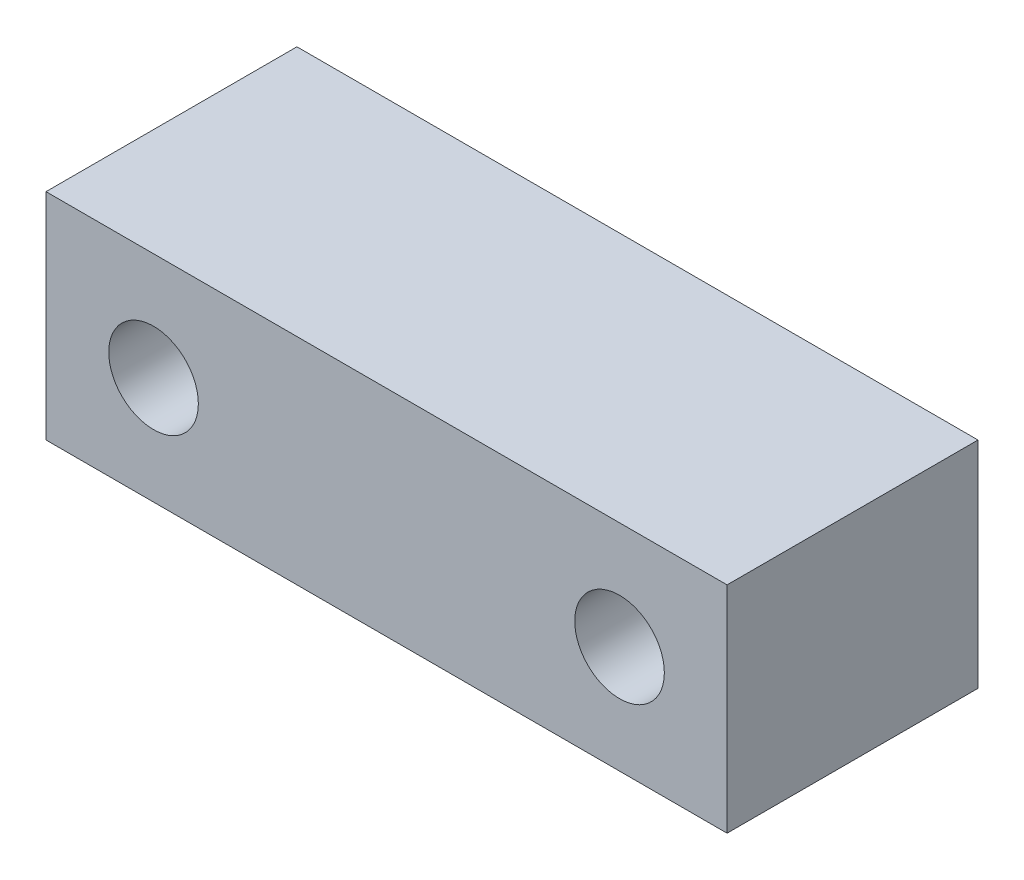
ISO-10303-21;
HEADER;
FILE_DESCRIPTION(('STEP AP214'),'2;1');
FILE_NAME('part.step','',(''),(''),'','','');
FILE_SCHEMA(('AUTOMOTIVE_DESIGN { 1 0 10303 214 1 1 1 1 }'));
ENDSEC;
DATA;
#1=APPLICATION_CONTEXT('core data for automotive mechanical design processes');
#2=APPLICATION_PROTOCOL_DEFINITION('international standard','automotive_design',2000,#1);
#3=PRODUCT_CONTEXT('',#1,'mechanical');
#4=PRODUCT('Part','Part','',(#3));
#5=PRODUCT_RELATED_PRODUCT_CATEGORY('part','',(#4));
#6=PRODUCT_DEFINITION_FORMATION('','',#4);
#7=PRODUCT_DEFINITION_CONTEXT('part definition',#1,'design');
#8=PRODUCT_DEFINITION('design','',#6,#7);
#9=PRODUCT_DEFINITION_SHAPE('','',#8);
#10=(LENGTH_UNIT() NAMED_UNIT(*) SI_UNIT(.MILLI.,.METRE.));
#11=(NAMED_UNIT(*) PLANE_ANGLE_UNIT() SI_UNIT($,.RADIAN.));
#12=(NAMED_UNIT(*) SI_UNIT($,.STERADIAN.) SOLID_ANGLE_UNIT());
#13=UNCERTAINTY_MEASURE_WITH_UNIT(LENGTH_MEASURE(1.E-05),#10,'distance_accuracy_value','');
#14=(GEOMETRIC_REPRESENTATION_CONTEXT(3) GLOBAL_UNCERTAINTY_ASSIGNED_CONTEXT((#13)) GLOBAL_UNIT_ASSIGNED_CONTEXT((#10,
#11,#12)) REPRESENTATION_CONTEXT('',''));
#15=CARTESIAN_POINT('',(0.,0.,0.));
#16=DIRECTION('',(0.,0.,1.));
#17=DIRECTION('',(1.,0.,0.));
#18=AXIS2_PLACEMENT_3D('',#15,#16,#17);
#19=CARTESIAN_POINT('',(0.,0.,7.));
#20=DIRECTION('',(0.,0.,1.));
#21=DIRECTION('',(1.,0.,0.));
#22=AXIS2_PLACEMENT_3D('',#19,#20,#21);
#23=PLANE('',#22);
#24=CARTESIAN_POINT('',(-6.5,0.,7.));
#25=DIRECTION('',(0.,0.,1.));
#26=DIRECTION('',(1.,0.,0.));
#27=AXIS2_PLACEMENT_3D('',#24,#25,#26);
#28=CIRCLE('',#27,1.25);
#29=CARTESIAN_POINT('',(-5.25,0.,7.));
#30=VERTEX_POINT('',#29);
#31=EDGE_CURVE('E106',#30,#30,#28,.T.);
#32=ORIENTED_EDGE('',*,*,#31,.F.);
#33=EDGE_LOOP('',(#32));
#34=FACE_BOUND('',#33,.T.);
#35=DIRECTION('',(-1.,0.,0.));
#36=VECTOR('',#35,1.);
#37=CARTESIAN_POINT('',(-9.5,3.,7.));
#38=LINE('',#37,#36);
#39=CARTESIAN_POINT('',(9.5,3.,7.));
#40=VERTEX_POINT('',#39);
#41=CARTESIAN_POINT('',(-9.5,3.,7.));
#42=VERTEX_POINT('',#41);
#43=EDGE_CURVE('E91',#40,#42,#38,.T.);
#44=ORIENTED_EDGE('',*,*,#43,.T.);
#45=DIRECTION('',(0.,-1.,0.));
#46=VECTOR('',#45,1.);
#47=CARTESIAN_POINT('',(-9.5,-3.,7.));
#48=LINE('',#47,#46);
#49=CARTESIAN_POINT('',(-9.5,-3.,7.));
#50=VERTEX_POINT('',#49);
#51=EDGE_CURVE('E87',#42,#50,#48,.T.);
#52=ORIENTED_EDGE('',*,*,#51,.T.);
#53=DIRECTION('',(1.,0.,0.));
#54=VECTOR('',#53,1.);
#55=CARTESIAN_POINT('',(-9.5,-3.,7.));
#56=LINE('',#55,#54);
#57=CARTESIAN_POINT('',(9.5,-3.,7.));
#58=VERTEX_POINT('',#57);
#59=EDGE_CURVE('E86',#50,#58,#56,.T.);
#60=ORIENTED_EDGE('',*,*,#59,.T.);
#61=DIRECTION('',(0.,1.,0.));
#62=VECTOR('',#61,1.);
#63=CARTESIAN_POINT('',(9.5,-3.,7.));
#64=LINE('',#63,#62);
#65=EDGE_CURVE('E57',#58,#40,#64,.T.);
#66=ORIENTED_EDGE('',*,*,#65,.T.);
#67=EDGE_LOOP('',(#44,#52,#60,#66));
#68=FACE_BOUND('',#67,.T.);
#69=CARTESIAN_POINT('',(6.5,0.,7.));
#70=DIRECTION('',(0.,0.,1.));
#71=DIRECTION('',(1.,0.,0.));
#72=AXIS2_PLACEMENT_3D('',#69,#70,#71);
#73=CIRCLE('',#72,1.25);
#74=CARTESIAN_POINT('',(7.75,0.,7.));
#75=VERTEX_POINT('',#74);
#76=EDGE_CURVE('E122',#75,#75,#73,.T.);
#77=ORIENTED_EDGE('',*,*,#76,.F.);
#78=EDGE_LOOP('',(#77));
#79=FACE_BOUND('',#78,.T.);
#80=ADVANCED_FACE('F39',(#34,#68,#79),#23,.T.);
#81=CARTESIAN_POINT('',(0.,0.,0.));
#82=DIRECTION('',(0.,0.,1.));
#83=DIRECTION('',(1.,0.,0.));
#84=AXIS2_PLACEMENT_3D('',#81,#82,#83);
#85=PLANE('',#84);
#86=DIRECTION('',(-1.,0.,0.));
#87=VECTOR('',#86,1.);
#88=CARTESIAN_POINT('',(-9.5,3.,0.));
#89=LINE('',#88,#87);
#90=CARTESIAN_POINT('',(9.5,3.,0.));
#91=VERTEX_POINT('',#90);
#92=CARTESIAN_POINT('',(-9.5,3.,0.));
#93=VERTEX_POINT('',#92);
#94=EDGE_CURVE('E101',#91,#93,#89,.T.);
#95=ORIENTED_EDGE('',*,*,#94,.F.);
#96=DIRECTION('',(0.,1.,0.));
#97=VECTOR('',#96,1.);
#98=CARTESIAN_POINT('',(9.5,-3.,0.));
#99=LINE('',#98,#97);
#100=CARTESIAN_POINT('',(9.5,-3.,0.));
#101=VERTEX_POINT('',#100);
#102=EDGE_CURVE('E79',#101,#91,#99,.T.);
#103=ORIENTED_EDGE('',*,*,#102,.F.);
#104=DIRECTION('',(1.,0.,0.));
#105=VECTOR('',#104,1.);
#106=CARTESIAN_POINT('',(-9.5,-3.,0.));
#107=LINE('',#106,#105);
#108=CARTESIAN_POINT('',(-9.5,-3.,0.));
#109=VERTEX_POINT('',#108);
#110=EDGE_CURVE('E72',#109,#101,#107,.T.);
#111=ORIENTED_EDGE('',*,*,#110,.F.);
#112=DIRECTION('',(0.,-1.,0.));
#113=VECTOR('',#112,1.);
#114=CARTESIAN_POINT('',(-9.5,-3.,0.));
#115=LINE('',#114,#113);
#116=EDGE_CURVE('E94',#93,#109,#115,.T.);
#117=ORIENTED_EDGE('',*,*,#116,.F.);
#118=EDGE_LOOP('',(#95,#103,#111,#117));
#119=FACE_BOUND('',#118,.T.);
#120=CARTESIAN_POINT('',(-6.5,0.,0.));
#121=DIRECTION('',(0.,0.,1.));
#122=DIRECTION('',(1.,0.,0.));
#123=AXIS2_PLACEMENT_3D('',#120,#121,#122);
#124=CIRCLE('',#123,1.25);
#125=CARTESIAN_POINT('',(-5.25,0.,0.));
#126=VERTEX_POINT('',#125);
#127=EDGE_CURVE('E117',#126,#126,#124,.T.);
#128=ORIENTED_EDGE('',*,*,#127,.T.);
#129=EDGE_LOOP('',(#128));
#130=FACE_BOUND('',#129,.T.);
#131=CARTESIAN_POINT('',(6.5,0.,0.));
#132=DIRECTION('',(0.,0.,1.));
#133=DIRECTION('',(1.,0.,0.));
#134=AXIS2_PLACEMENT_3D('',#131,#132,#133);
#135=CIRCLE('',#134,1.25);
#136=CARTESIAN_POINT('',(7.75,0.,0.));
#137=VERTEX_POINT('',#136);
#138=EDGE_CURVE('E121',#137,#137,#135,.T.);
#139=ORIENTED_EDGE('',*,*,#138,.T.);
#140=EDGE_LOOP('',(#139));
#141=FACE_BOUND('',#140,.T.);
#142=ADVANCED_FACE('F112',(#119,#130,#141),#85,.F.);
#143=CARTESIAN_POINT('',(-9.5,3.,7.));
#144=DIRECTION('',(0.,-1.,0.));
#145=DIRECTION('',(1.,0.,0.));
#146=AXIS2_PLACEMENT_3D('',#143,#144,#145);
#147=PLANE('',#146);
#148=ORIENTED_EDGE('',*,*,#94,.T.);
#149=DIRECTION('',(0.,0.,-1.));
#150=VECTOR('',#149,1.);
#151=CARTESIAN_POINT('',(-9.5,3.,7.));
#152=LINE('',#151,#150);
#153=EDGE_CURVE('E11',#42,#93,#152,.T.);
#154=ORIENTED_EDGE('',*,*,#153,.F.);
#155=ORIENTED_EDGE('',*,*,#43,.F.);
#156=DIRECTION('',(0.,0.,-1.));
#157=VECTOR('',#156,1.);
#158=CARTESIAN_POINT('',(9.5,3.,7.));
#159=LINE('',#158,#157);
#160=EDGE_CURVE('E100',#40,#91,#159,.T.);
#161=ORIENTED_EDGE('',*,*,#160,.T.);
#162=EDGE_LOOP('',(#148,#154,#155,#161));
#163=FACE_BOUND('',#162,.T.);
#164=ADVANCED_FACE('F41',(#163),#147,.F.);
#165=CARTESIAN_POINT('',(-9.5,-3.,7.));
#166=DIRECTION('',(1.,0.,0.));
#167=DIRECTION('',(0.,0.,-1.));
#168=AXIS2_PLACEMENT_3D('',#165,#166,#167);
#169=PLANE('',#168);
#170=ORIENTED_EDGE('',*,*,#116,.T.);
#171=DIRECTION('',(0.,0.,-1.));
#172=VECTOR('',#171,1.);
#173=CARTESIAN_POINT('',(-9.5,-3.,7.));
#174=LINE('',#173,#172);
#175=EDGE_CURVE('E48',#50,#109,#174,.T.);
#176=ORIENTED_EDGE('',*,*,#175,.F.);
#177=ORIENTED_EDGE('',*,*,#51,.F.);
#178=ORIENTED_EDGE('',*,*,#153,.T.);
#179=EDGE_LOOP('',(#170,#176,#177,#178));
#180=FACE_BOUND('',#179,.T.);
#181=ADVANCED_FACE('F93',(#180),#169,.F.);
#182=CARTESIAN_POINT('',(-9.5,-3.,7.));
#183=DIRECTION('',(0.,1.,0.));
#184=DIRECTION('',(-1.,0.,0.));
#185=AXIS2_PLACEMENT_3D('',#182,#183,#184);
#186=PLANE('',#185);
#187=ORIENTED_EDGE('',*,*,#110,.T.);
#188=DIRECTION('',(0.,0.,-1.));
#189=VECTOR('',#188,1.);
#190=CARTESIAN_POINT('',(9.5,-3.,7.));
#191=LINE('',#190,#189);
#192=EDGE_CURVE('E98',#58,#101,#191,.T.);
#193=ORIENTED_EDGE('',*,*,#192,.F.);
#194=ORIENTED_EDGE('',*,*,#59,.F.);
#195=ORIENTED_EDGE('',*,*,#175,.T.);
#196=EDGE_LOOP('',(#187,#193,#194,#195));
#197=FACE_BOUND('',#196,.T.);
#198=ADVANCED_FACE('F97',(#197),#186,.F.);
#199=CARTESIAN_POINT('',(9.5,-3.,7.));
#200=DIRECTION('',(-1.,0.,0.));
#201=DIRECTION('',(0.,0.,1.));
#202=AXIS2_PLACEMENT_3D('',#199,#200,#201);
#203=PLANE('',#202);
#204=ORIENTED_EDGE('',*,*,#102,.T.);
#205=ORIENTED_EDGE('',*,*,#160,.F.);
#206=ORIENTED_EDGE('',*,*,#65,.F.);
#207=ORIENTED_EDGE('',*,*,#192,.T.);
#208=EDGE_LOOP('',(#204,#205,#206,#207));
#209=FACE_BOUND('',#208,.T.);
#210=ADVANCED_FACE('F111',(#209),#203,.F.);
#211=CARTESIAN_POINT('',(-6.5,0.,7.));
#212=DIRECTION('',(0.,0.,-1.));
#213=DIRECTION('',(-1.,0.,0.));
#214=AXIS2_PLACEMENT_3D('',#211,#212,#213);
#215=CYLINDRICAL_SURFACE('',#214,1.25);
#216=ORIENTED_EDGE('',*,*,#31,.T.);
#217=EDGE_LOOP('',(#216));
#218=FACE_BOUND('',#217,.T.);
#219=ORIENTED_EDGE('',*,*,#127,.F.);
#220=EDGE_LOOP('',(#219));
#221=FACE_BOUND('',#220,.T.);
#222=ADVANCED_FACE('F142',(#218,#221),#215,.F.);
#223=CARTESIAN_POINT('',(6.5,0.,7.));
#224=DIRECTION('',(0.,0.,-1.));
#225=DIRECTION('',(-1.,0.,0.));
#226=AXIS2_PLACEMENT_3D('',#223,#224,#225);
#227=CYLINDRICAL_SURFACE('',#226,1.25);
#228=ORIENTED_EDGE('',*,*,#76,.T.);
#229=EDGE_LOOP('',(#228));
#230=FACE_BOUND('',#229,.T.);
#231=ORIENTED_EDGE('',*,*,#138,.F.);
#232=EDGE_LOOP('',(#231));
#233=FACE_BOUND('',#232,.T.);
#234=ADVANCED_FACE('F128',(#230,#233),#227,.F.);
#235=CLOSED_SHELL('',(#80,#142,#164,#181,#198,#210,#222,#234));
#236=MANIFOLD_SOLID_BREP('B2',#235);
#237=ADVANCED_BREP_SHAPE_REPRESENTATION('',(#18,#236),#14);
#238=SHAPE_DEFINITION_REPRESENTATION(#9,#237);
ENDSEC;
END-ISO-10303-21;
